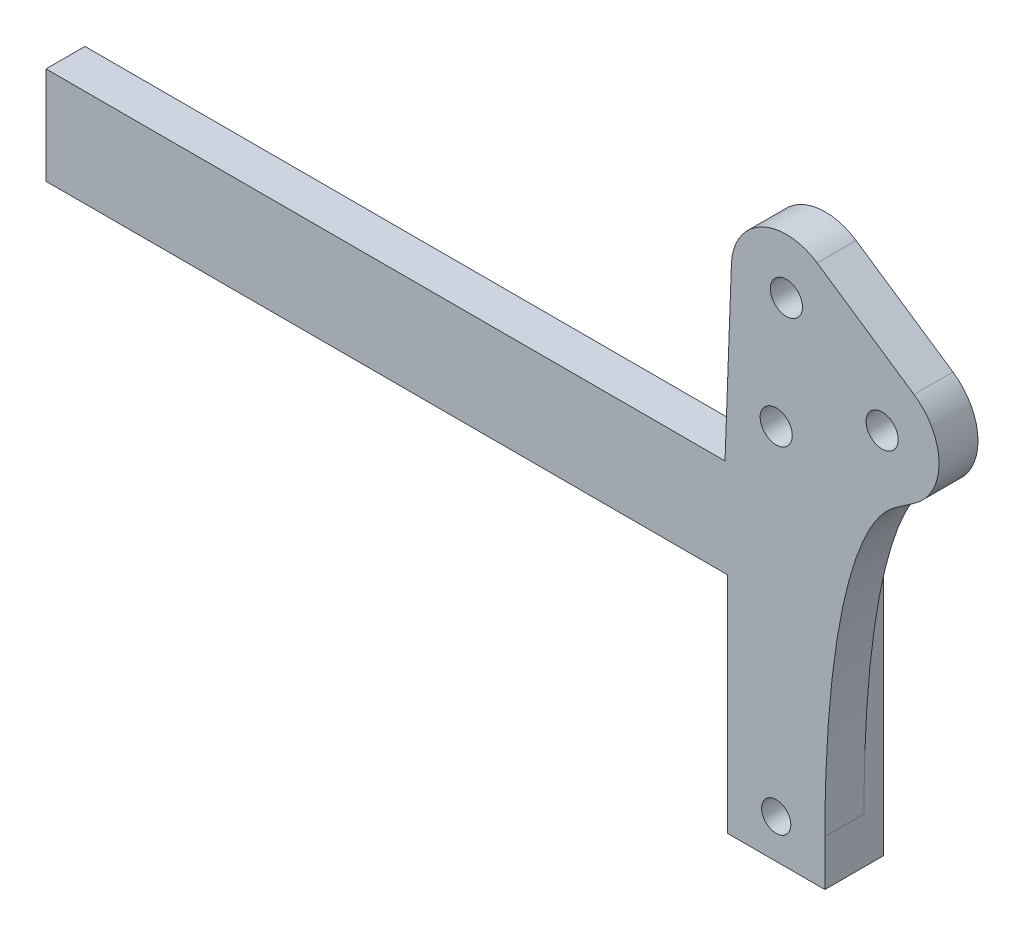
ISO-10303-21;
HEADER;
FILE_DESCRIPTION(('STEP AP214'),'2;1');
FILE_NAME('part.step','',(''),(''),'','','');
FILE_SCHEMA(('AUTOMOTIVE_DESIGN { 1 0 10303 214 1 1 1 1 }'));
ENDSEC;
DATA;
#1=APPLICATION_CONTEXT('core data for automotive mechanical design processes');
#2=APPLICATION_PROTOCOL_DEFINITION('international standard','automotive_design',2000,#1);
#3=PRODUCT_CONTEXT('',#1,'mechanical');
#4=PRODUCT('Part','Part','',(#3));
#5=PRODUCT_RELATED_PRODUCT_CATEGORY('part','',(#4));
#6=PRODUCT_DEFINITION_FORMATION('','',#4);
#7=PRODUCT_DEFINITION_CONTEXT('part definition',#1,'design');
#8=PRODUCT_DEFINITION('design','',#6,#7);
#9=PRODUCT_DEFINITION_SHAPE('','',#8);
#10=(LENGTH_UNIT() NAMED_UNIT(*) SI_UNIT(.MILLI.,.METRE.));
#11=(NAMED_UNIT(*) PLANE_ANGLE_UNIT() SI_UNIT($,.RADIAN.));
#12=(NAMED_UNIT(*) SI_UNIT($,.STERADIAN.) SOLID_ANGLE_UNIT());
#13=UNCERTAINTY_MEASURE_WITH_UNIT(LENGTH_MEASURE(1.E-05),#10,'distance_accuracy_value','');
#14=(GEOMETRIC_REPRESENTATION_CONTEXT(3) GLOBAL_UNCERTAINTY_ASSIGNED_CONTEXT((#13)) GLOBAL_UNIT_ASSIGNED_CONTEXT((#10,
#11,#12)) REPRESENTATION_CONTEXT('',''));
#15=CARTESIAN_POINT('',(0.,0.,0.));
#16=DIRECTION('',(0.,0.,1.));
#17=DIRECTION('',(1.,0.,0.));
#18=AXIS2_PLACEMENT_3D('',#15,#16,#17);
#19=CARTESIAN_POINT('',(40.,0.,6.));
#20=DIRECTION('',(1.,0.,0.));
#21=DIRECTION('',(0.,1.,0.));
#22=AXIS2_PLACEMENT_3D('',#19,#20,#21);
#23=PLANE('',#22);
#24=DIRECTION('',(0.,0.,1.));
#25=VECTOR('',#24,1.);
#26=CARTESIAN_POINT('',(40.,4.61249162773132,6.));
#27=LINE('',#26,#25);
#28=CARTESIAN_POINT('',(40.,4.61249162773132,0.));
#29=VERTEX_POINT('',#28);
#30=CARTESIAN_POINT('',(40.,4.61249162773133,2.));
#31=VERTEX_POINT('',#30);
#32=EDGE_CURVE('E178',#29,#31,#27,.T.);
#33=ORIENTED_EDGE('',*,*,#32,.T.);
#34=DIRECTION('',(0.,-1.,0.));
#35=VECTOR('',#34,1.);
#36=CARTESIAN_POINT('',(40.,0.,2.));
#37=LINE('',#36,#35);
#38=CARTESIAN_POINT('',(40.,-23.2876292932115,2.));
#39=VERTEX_POINT('',#38);
#40=EDGE_CURVE('E67',#31,#39,#37,.T.);
#41=ORIENTED_EDGE('',*,*,#40,.T.);
#42=CARTESIAN_POINT('',(40.,-23.2876292932115,6.20000000000002));
#43=CARTESIAN_POINT('',(40.,-23.2876292932115,4.73333333333335));
#44=CARTESIAN_POINT('',(40.,-23.2876292932115,3.26666666666667));
#45=CARTESIAN_POINT('',(40.,-23.2876292932115,1.8));
#46=(BOUNDED_CURVE() B_SPLINE_CURVE(3,(#42,#43,#44,#45),.UNSPECIFIED.,.F.,
.F.) B_SPLINE_CURVE_WITH_KNOTS((4,4),(-0.03783313004407,-0.03343313004407),
.UNSPECIFIED.) CURVE() GEOMETRIC_REPRESENTATION_ITEM() RATIONAL_B_SPLINE_CURVE((1.,1.,1.,1.)) REPRESENTATION_ITEM(''));
#47=CARTESIAN_POINT('',(40.,-23.2876292932115,6.));
#48=VERTEX_POINT('',#47);
#49=EDGE_CURVE('E268',#39,#48,#46,.F.);
#50=ORIENTED_EDGE('',*,*,#49,.T.);
#51=DIRECTION('',(0.,-1.,0.));
#52=VECTOR('',#51,1.);
#53=CARTESIAN_POINT('',(40.,0.,6.));
#54=LINE('',#53,#52);
#55=CARTESIAN_POINT('',(40.,-28.,6.));
#56=VERTEX_POINT('',#55);
#57=EDGE_CURVE('E259',#48,#56,#54,.T.);
#58=ORIENTED_EDGE('',*,*,#57,.T.);
#59=DIRECTION('',(0.,0.,-1.));
#60=VECTOR('',#59,1.);
#61=CARTESIAN_POINT('',(40.,-28.,6.));
#62=LINE('',#61,#60);
#63=CARTESIAN_POINT('',(40.,-28.,0.));
#64=VERTEX_POINT('',#63);
#65=EDGE_CURVE('E371',#56,#64,#62,.T.);
#66=ORIENTED_EDGE('',*,*,#65,.T.);
#67=DIRECTION('',(0.,-1.,0.));
#68=VECTOR('',#67,1.);
#69=CARTESIAN_POINT('',(40.,0.,0.));
#70=LINE('',#69,#68);
#71=EDGE_CURVE('E253',#29,#64,#70,.T.);
#72=ORIENTED_EDGE('',*,*,#71,.F.);
#73=EDGE_LOOP('',(#33,#41,#50,#58,#66,#72));
#74=FACE_BOUND('',#73,.T.);
#75=ADVANCED_FACE('F46',(#74),#23,.T.);
#76=CARTESIAN_POINT('',(30.,0.,6.));
#77=DIRECTION('',(1.,0.,0.));
#78=DIRECTION('',(0.,1.,0.));
#79=AXIS2_PLACEMENT_3D('',#76,#77,#78);
#80=PLANE('',#79);
#81=DIRECTION('',(0.,0.,1.));
#82=VECTOR('',#81,1.);
#83=CARTESIAN_POINT('',(30.,4.64834733316593,-4.));
#84=LINE('',#83,#82);
#85=CARTESIAN_POINT('',(30.,4.64834733316593,0.));
#86=VERTEX_POINT('',#85);
#87=CARTESIAN_POINT('',(30.,4.64834733316593,2.));
#88=VERTEX_POINT('',#87);
#89=EDGE_CURVE('E174',#86,#88,#84,.T.);
#90=ORIENTED_EDGE('',*,*,#89,.F.);
#91=DIRECTION('',(0.,-1.,0.));
#92=VECTOR('',#91,1.);
#93=CARTESIAN_POINT('',(30.,0.,0.));
#94=LINE('',#93,#92);
#95=CARTESIAN_POINT('',(30.,-28.,0.));
#96=VERTEX_POINT('',#95);
#97=EDGE_CURVE('E377',#86,#96,#94,.T.);
#98=ORIENTED_EDGE('',*,*,#97,.T.);
#99=DIRECTION('',(0.,0.,-1.));
#100=VECTOR('',#99,1.);
#101=CARTESIAN_POINT('',(30.,-28.,6.));
#102=LINE('',#101,#100);
#103=CARTESIAN_POINT('',(30.,-28.,6.));
#104=VERTEX_POINT('',#103);
#105=EDGE_CURVE('E368',#104,#96,#102,.T.);
#106=ORIENTED_EDGE('',*,*,#105,.F.);
#107=DIRECTION('',(0.,-1.,0.));
#108=VECTOR('',#107,1.);
#109=CARTESIAN_POINT('',(30.,0.,6.));
#110=LINE('',#109,#108);
#111=CARTESIAN_POINT('',(30.,-5.,6.));
#112=VERTEX_POINT('',#111);
#113=EDGE_CURVE('E382',#112,#104,#110,.T.);
#114=ORIENTED_EDGE('',*,*,#113,.F.);
#115=DIRECTION('',(0.,0.,-1.));
#116=VECTOR('',#115,1.);
#117=CARTESIAN_POINT('',(30.,-5.,6.));
#118=LINE('',#117,#116);
#119=CARTESIAN_POINT('',(30.,-5.,2.));
#120=VERTEX_POINT('',#119);
#121=EDGE_CURVE('E363',#112,#120,#118,.T.);
#122=ORIENTED_EDGE('',*,*,#121,.T.);
#123=DIRECTION('',(0.,-1.,0.));
#124=VECTOR('',#123,1.);
#125=CARTESIAN_POINT('',(30.,0.,2.));
#126=LINE('',#125,#124);
#127=EDGE_CURVE('E245',#88,#120,#126,.T.);
#128=ORIENTED_EDGE('',*,*,#127,.F.);
#129=EDGE_LOOP('',(#90,#98,#106,#114,#122,#128));
#130=FACE_BOUND('',#129,.T.);
#131=ADVANCED_FACE('F282',(#130),#80,.F.);
#132=CARTESIAN_POINT('',(0.,0.,0.));
#133=DIRECTION('',(0.,0.,1.));
#134=DIRECTION('',(1.,0.,0.));
#135=AXIS2_PLACEMENT_3D('',#132,#133,#134);
#136=PLANE('',#135);
#137=CARTESIAN_POINT('',(35.,-24.,0.));
#138=DIRECTION('',(0.,0.,1.));
#139=DIRECTION('',(1.,0.,0.));
#140=AXIS2_PLACEMENT_3D('',#137,#138,#139);
#141=CIRCLE('',#140,1.5);
#142=CARTESIAN_POINT('',(36.5,-24.,0.));
#143=VERTEX_POINT('',#142);
#144=EDGE_CURVE('E183',#143,#143,#141,.T.);
#145=ORIENTED_EDGE('',*,*,#144,.T.);
#146=EDGE_LOOP('',(#145));
#147=FACE_BOUND('',#146,.T.);
#148=CARTESIAN_POINT('',(35.,10.7,0.));
#149=DIRECTION('',(0.,0.,1.));
#150=DIRECTION('',(1.,0.,0.));
#151=AXIS2_PLACEMENT_3D('',#148,#149,#150);
#152=CIRCLE('',#151,7.85);
#153=CARTESIAN_POINT('',(39.4569044098538,4.23791805364355,0.));
#154=VERTEX_POINT('',#153);
#155=EDGE_CURVE('E180',#154,#86,#152,.F.);
#156=ORIENTED_EDGE('',*,*,#155,.F.);
#157=DIRECTION('',(-0.823195152402095,-0.567758523548252,0.));
#158=VECTOR('',#157,1.);
#159=CARTESIAN_POINT('',(10.7382214587901,-15.5693864269128,0.));
#160=LINE('',#159,#158);
#161=EDGE_CURVE('E161',#29,#154,#160,.T.);
#162=ORIENTED_EDGE('',*,*,#161,.F.);
#163=ORIENTED_EDGE('',*,*,#71,.T.);
#164=DIRECTION('',(-1.,0.,0.));
#165=VECTOR('',#164,1.);
#166=CARTESIAN_POINT('',(0.,-28.,0.));
#167=LINE('',#166,#165);
#168=EDGE_CURVE('E261',#64,#96,#167,.T.);
#169=ORIENTED_EDGE('',*,*,#168,.T.);
#170=ORIENTED_EDGE('',*,*,#97,.F.);
#171=EDGE_LOOP('',(#156,#162,#163,#169,#170));
#172=FACE_BOUND('',#171,.T.);
#173=ADVANCED_FACE('F299',(#147,#172),#136,.F.);
#174=CARTESIAN_POINT('',(35.,10.7,39.63313004407));
#175=DIRECTION('',(0.,0.,-1.));
#176=DIRECTION('',(-1.,0.,0.));
#177=AXIS2_PLACEMENT_3D('',#174,#175,#176);
#178=CYLINDRICAL_SURFACE('',#177,1.65);
#179=CARTESIAN_POINT('',(35.,10.7,6.));
#180=DIRECTION('',(0.,0.,1.));
#181=DIRECTION('',(1.,0.,0.));
#182=AXIS2_PLACEMENT_3D('',#179,#180,#181);
#183=CIRCLE('',#182,1.65);
#184=CARTESIAN_POINT('',(36.65,10.7,6.));
#185=VERTEX_POINT('',#184);
#186=EDGE_CURVE('E246',#185,#185,#183,.F.);
#187=ORIENTED_EDGE('',*,*,#186,.F.);
#188=EDGE_LOOP('',(#187));
#189=FACE_BOUND('',#188,.T.);
#190=CARTESIAN_POINT('',(35.,10.7,2.));
#191=DIRECTION('',(0.,0.,-1.));
#192=DIRECTION('',(-1.,0.,0.));
#193=AXIS2_PLACEMENT_3D('',#190,#191,#192);
#194=CIRCLE('',#193,1.65);
#195=CARTESIAN_POINT('',(33.35,10.7,2.));
#196=VERTEX_POINT('',#195);
#197=EDGE_CURVE('E213',#196,#196,#194,.T.);
#198=ORIENTED_EDGE('',*,*,#197,.T.);
#199=EDGE_LOOP('',(#198));
#200=FACE_BOUND('',#199,.T.);
#201=ADVANCED_FACE('F287',(#189,#200),#178,.F.);
#202=CARTESIAN_POINT('',(0.,5.,6.));
#203=DIRECTION('',(0.,1.,0.));
#204=DIRECTION('',(0.,0.,1.));
#205=AXIS2_PLACEMENT_3D('',#202,#203,#204);
#206=PLANE('',#205);
#207=DIRECTION('',(0.,0.,-1.));
#208=VECTOR('',#207,1.);
#209=CARTESIAN_POINT('',(29.7424226194983,5.,39.63313004407));
#210=LINE('',#209,#208);
#211=CARTESIAN_POINT('',(29.7424226194983,5.,6.));
#212=VERTEX_POINT('',#211);
#213=CARTESIAN_POINT('',(29.7424226194983,5.,2.));
#214=VERTEX_POINT('',#213);
#215=EDGE_CURVE('E230',#212,#214,#210,.T.);
#216=ORIENTED_EDGE('',*,*,#215,.T.);
#217=DIRECTION('',(1.,0.,0.));
#218=VECTOR('',#217,1.);
#219=CARTESIAN_POINT('',(0.,5.,2.));
#220=LINE('',#219,#218);
#221=CARTESIAN_POINT('',(-40.,5.,2.));
#222=VERTEX_POINT('',#221);
#223=EDGE_CURVE('E248',#222,#214,#220,.T.);
#224=ORIENTED_EDGE('',*,*,#223,.F.);
#225=DIRECTION('',(0.,0.,-1.));
#226=VECTOR('',#225,1.);
#227=CARTESIAN_POINT('',(-40.,5.,6.));
#228=LINE('',#227,#226);
#229=CARTESIAN_POINT('',(-40.,5.,6.));
#230=VERTEX_POINT('',#229);
#231=EDGE_CURVE('E355',#230,#222,#228,.T.);
#232=ORIENTED_EDGE('',*,*,#231,.F.);
#233=DIRECTION('',(1.,0.,0.));
#234=VECTOR('',#233,1.);
#235=CARTESIAN_POINT('',(0.,5.,6.));
#236=LINE('',#235,#234);
#237=EDGE_CURVE('E256',#230,#212,#236,.T.);
#238=ORIENTED_EDGE('',*,*,#237,.T.);
#239=EDGE_LOOP('',(#216,#224,#232,#238));
#240=FACE_BOUND('',#239,.T.);
#241=ADVANCED_FACE('F283',(#240),#206,.T.);
#242=CARTESIAN_POINT('',(-40.,0.,6.));
#243=DIRECTION('',(-1.,0.,0.));
#244=DIRECTION('',(0.,0.,1.));
#245=AXIS2_PLACEMENT_3D('',#242,#243,#244);
#246=PLANE('',#245);
#247=DIRECTION('',(0.,1.,0.));
#248=VECTOR('',#247,1.);
#249=CARTESIAN_POINT('',(-40.,0.,2.));
#250=LINE('',#249,#248);
#251=CARTESIAN_POINT('',(-40.,-5.,2.));
#252=VERTEX_POINT('',#251);
#253=EDGE_CURVE('E251',#252,#222,#250,.T.);
#254=ORIENTED_EDGE('',*,*,#253,.F.);
#255=DIRECTION('',(0.,0.,-1.));
#256=VECTOR('',#255,1.);
#257=CARTESIAN_POINT('',(-40.,-5.,6.));
#258=LINE('',#257,#256);
#259=CARTESIAN_POINT('',(-40.,-5.,6.));
#260=VERTEX_POINT('',#259);
#261=EDGE_CURVE('E359',#260,#252,#258,.T.);
#262=ORIENTED_EDGE('',*,*,#261,.F.);
#263=DIRECTION('',(0.,1.,0.));
#264=VECTOR('',#263,1.);
#265=CARTESIAN_POINT('',(-40.,0.,6.));
#266=LINE('',#265,#264);
#267=EDGE_CURVE('E385',#260,#230,#266,.T.);
#268=ORIENTED_EDGE('',*,*,#267,.T.);
#269=ORIENTED_EDGE('',*,*,#231,.T.);
#270=EDGE_LOOP('',(#254,#262,#268,#269));
#271=FACE_BOUND('',#270,.T.);
#272=ADVANCED_FACE('F286',(#271),#246,.T.);
#273=CARTESIAN_POINT('',(0.,-5.,6.));
#274=DIRECTION('',(0.,1.,0.));
#275=DIRECTION('',(0.,0.,1.));
#276=AXIS2_PLACEMENT_3D('',#273,#274,#275);
#277=PLANE('',#276);
#278=ORIENTED_EDGE('',*,*,#261,.T.);
#279=DIRECTION('',(1.,0.,0.));
#280=VECTOR('',#279,1.);
#281=CARTESIAN_POINT('',(0.,-5.,2.));
#282=LINE('',#281,#280);
#283=EDGE_CURVE('E242',#252,#120,#282,.T.);
#284=ORIENTED_EDGE('',*,*,#283,.T.);
#285=ORIENTED_EDGE('',*,*,#121,.F.);
#286=DIRECTION('',(1.,0.,0.));
#287=VECTOR('',#286,1.);
#288=CARTESIAN_POINT('',(0.,-5.,6.));
#289=LINE('',#288,#287);
#290=EDGE_CURVE('E384',#260,#112,#289,.T.);
#291=ORIENTED_EDGE('',*,*,#290,.F.);
#292=EDGE_LOOP('',(#278,#284,#285,#291));
#293=FACE_BOUND('',#292,.T.);
#294=ADVANCED_FACE('F291',(#293),#277,.F.);
#295=CARTESIAN_POINT('',(0.,-28.,6.));
#296=DIRECTION('',(0.,-1.,0.));
#297=DIRECTION('',(0.,0.,-1.));
#298=AXIS2_PLACEMENT_3D('',#295,#296,#297);
#299=PLANE('',#298);
#300=ORIENTED_EDGE('',*,*,#168,.F.);
#301=ORIENTED_EDGE('',*,*,#65,.F.);
#302=DIRECTION('',(-1.,0.,0.));
#303=VECTOR('',#302,1.);
#304=CARTESIAN_POINT('',(0.,-28.,6.));
#305=LINE('',#304,#303);
#306=EDGE_CURVE('E374',#56,#104,#305,.T.);
#307=ORIENTED_EDGE('',*,*,#306,.T.);
#308=ORIENTED_EDGE('',*,*,#105,.T.);
#309=EDGE_LOOP('',(#300,#301,#307,#308));
#310=FACE_BOUND('',#309,.T.);
#311=ADVANCED_FACE('F295',(#310),#299,.T.);
#312=CARTESIAN_POINT('',(0.,0.,6.));
#313=DIRECTION('',(0.,0.,1.));
#314=DIRECTION('',(1.,0.,0.));
#315=AXIS2_PLACEMENT_3D('',#312,#313,#314);
#316=PLANE('',#315);
#317=CARTESIAN_POINT('',(35.,-24.,6.));
#318=DIRECTION('',(0.,0.,1.));
#319=DIRECTION('',(1.,0.,0.));
#320=AXIS2_PLACEMENT_3D('',#317,#318,#319);
#321=CIRCLE('',#320,1.5);
#322=CARTESIAN_POINT('',(36.5,-24.,6.));
#323=VERTEX_POINT('',#322);
#324=EDGE_CURVE('E184',#323,#323,#321,.T.);
#325=ORIENTED_EDGE('',*,*,#324,.F.);
#326=EDGE_LOOP('',(#325));
#327=FACE_BOUND('',#326,.T.);
#328=ORIENTED_EDGE('',*,*,#186,.T.);
#329=EDGE_LOOP('',(#328));
#330=FACE_BOUND('',#329,.T.);
#331=ORIENTED_EDGE('',*,*,#57,.F.);
#332=CARTESIAN_POINT('',(47.2896590580699,9.64017680287228,6.));
#333=CARTESIAN_POINT('',(40.,4.61249162773133,6.));
#334=CARTESIAN_POINT('',(40.,-23.2876292932115,6.));
#335=(BOUNDED_CURVE() B_SPLINE_CURVE(2,(#332,#333,#334),.UNSPECIFIED.,.F.,
.F.) B_SPLINE_CURVE_WITH_KNOTS((3,3),(0.,1.),
.UNSPECIFIED.) CURVE() GEOMETRIC_REPRESENTATION_ITEM() RATIONAL_B_SPLINE_CURVE((1.,
0.88536956225868,1.)) REPRESENTATION_ITEM(''));
#336=CARTESIAN_POINT('',(47.2896590580699,9.64017680287228,6.));
#337=VERTEX_POINT('',#336);
#338=EDGE_CURVE('E12',#48,#337,#335,.F.);
#339=ORIENTED_EDGE('',*,*,#338,.T.);
#340=DIRECTION('',(-0.823195152402095,-0.567758523548252,0.));
#341=VECTOR('',#340,1.);
#342=CARTESIAN_POINT('',(10.7382214587901,-15.5693864269128,6.));
#343=LINE('',#342,#341);
#344=CARTESIAN_POINT('',(49.1970808071971,10.9557274993362,6.));
#345=VERTEX_POINT('',#344);
#346=EDGE_CURVE('E198',#345,#337,#343,.T.);
#347=ORIENTED_EDGE('',*,*,#346,.F.);
#348=CARTESIAN_POINT('',(45.8756934444398,15.7714191408884,6.));
#349=DIRECTION('',(0.,0.,1.));
#350=DIRECTION('',(1.,0.,0.));
#351=AXIS2_PLACEMENT_3D('',#348,#349,#350);
#352=CIRCLE('',#351,5.85);
#353=CARTESIAN_POINT('',(49.1507822095529,20.6187166952613,6.));
#354=VERTEX_POINT('',#353);
#355=EDGE_CURVE('E195',#354,#345,#352,.F.);
#356=ORIENTED_EDGE('',*,*,#355,.F.);
#357=DIRECTION('',(0.828597872542378,-0.559844233352675,0.));
#358=VECTOR('',#357,1.);
#359=CARTESIAN_POINT('',(24.9698403813028,36.9566307645373,6.));
#360=LINE('',#359,#358);
#361=CARTESIAN_POINT('',(39.2089888314145,27.3359143569654,6.));
#362=VERTEX_POINT('',#361);
#363=EDGE_CURVE('E192',#362,#354,#360,.T.);
#364=ORIENTED_EDGE('',*,*,#363,.F.);
#365=CARTESIAN_POINT('',(36.0458689129719,22.6543363771009,6.));
#366=DIRECTION('',(0.,0.,1.));
#367=DIRECTION('',(1.,0.,0.));
#368=AXIS2_PLACEMENT_3D('',#365,#366,#367);
#369=CIRCLE('',#368,5.65);
#370=CARTESIAN_POINT('',(30.3996900891645,22.8620975129981,6.));
#371=VERTEX_POINT('',#370);
#372=EDGE_CURVE('E189',#371,#362,#369,.F.);
#373=ORIENTED_EDGE('',*,*,#372,.F.);
#374=DIRECTION('',(0.0367718824596779,0.999323685629622,0.));
#375=VECTOR('',#374,1.);
#376=CARTESIAN_POINT('',(29.5184707025254,-1.0861843371388,6.));
#377=LINE('',#376,#375);
#378=EDGE_CURVE('E187',#212,#371,#377,.T.);
#379=ORIENTED_EDGE('',*,*,#378,.F.);
#380=ORIENTED_EDGE('',*,*,#237,.F.);
#381=ORIENTED_EDGE('',*,*,#267,.F.);
#382=ORIENTED_EDGE('',*,*,#290,.T.);
#383=ORIENTED_EDGE('',*,*,#113,.T.);
#384=ORIENTED_EDGE('',*,*,#306,.F.);
#385=EDGE_LOOP('',(#331,#339,#347,#356,#364,#373,#379,#380,#381,#382,#383,#384));
#386=FACE_BOUND('',#385,.T.);
#387=CARTESIAN_POINT('',(45.8756934444398,15.7714191408884,6.));
#388=DIRECTION('',(0.,0.,1.));
#389=DIRECTION('',(1.,0.,0.));
#390=AXIS2_PLACEMENT_3D('',#387,#388,#389);
#391=CIRCLE('',#390,1.65);
#392=CARTESIAN_POINT('',(47.5256934444398,15.7714191408884,6.));
#393=VERTEX_POINT('',#392);
#394=EDGE_CURVE('E449',#393,#393,#391,.F.);
#395=ORIENTED_EDGE('',*,*,#394,.T.);
#396=EDGE_LOOP('',(#395));
#397=FACE_BOUND('',#396,.T.);
#398=CARTESIAN_POINT('',(36.0458689129719,22.6543363771009,6.));
#399=DIRECTION('',(0.,0.,1.));
#400=DIRECTION('',(1.,0.,0.));
#401=AXIS2_PLACEMENT_3D('',#398,#399,#400);
#402=CIRCLE('',#401,1.65);
#403=CARTESIAN_POINT('',(37.6958689129719,22.6543363771009,6.));
#404=VERTEX_POINT('',#403);
#405=EDGE_CURVE('E201',#404,#404,#402,.F.);
#406=ORIENTED_EDGE('',*,*,#405,.T.);
#407=EDGE_LOOP('',(#406));
#408=FACE_BOUND('',#407,.T.);
#409=ADVANCED_FACE('F303',(#327,#330,#386,#397,#408),#316,.T.);
#410=CARTESIAN_POINT('',(0.,0.,2.));
#411=DIRECTION('',(0.,0.,1.));
#412=DIRECTION('',(1.,0.,0.));
#413=AXIS2_PLACEMENT_3D('',#410,#411,#412);
#414=PLANE('',#413);
#415=ORIENTED_EDGE('',*,*,#197,.F.);
#416=EDGE_LOOP('',(#415));
#417=FACE_BOUND('',#416,.T.);
#418=DIRECTION('',(0.0367718824596779,0.999323685629622,0.));
#419=VECTOR('',#418,1.);
#420=CARTESIAN_POINT('',(29.5184707025254,-1.0861843371388,2.));
#421=LINE('',#420,#419);
#422=CARTESIAN_POINT('',(30.3996900891645,22.8620975129981,2.));
#423=VERTEX_POINT('',#422);
#424=EDGE_CURVE('E212',#214,#423,#421,.T.);
#425=ORIENTED_EDGE('',*,*,#424,.T.);
#426=CARTESIAN_POINT('',(36.0458689129719,22.6543363771009,2.));
#427=DIRECTION('',(0.,0.,-1.));
#428=DIRECTION('',(-1.,0.,0.));
#429=AXIS2_PLACEMENT_3D('',#426,#427,#428);
#430=CIRCLE('',#429,5.65);
#431=CARTESIAN_POINT('',(39.2089888314145,27.3359143569654,2.));
#432=VERTEX_POINT('',#431);
#433=EDGE_CURVE('E221',#423,#432,#430,.T.);
#434=ORIENTED_EDGE('',*,*,#433,.T.);
#435=DIRECTION('',(0.828597872542378,-0.559844233352675,0.));
#436=VECTOR('',#435,1.);
#437=CARTESIAN_POINT('',(24.9698403813028,36.9566307645373,2.));
#438=LINE('',#437,#436);
#439=CARTESIAN_POINT('',(49.1507822095529,20.6187166952613,2.));
#440=VERTEX_POINT('',#439);
#441=EDGE_CURVE('E224',#432,#440,#438,.T.);
#442=ORIENTED_EDGE('',*,*,#441,.T.);
#443=CARTESIAN_POINT('',(45.8756934444398,15.7714191408884,2.));
#444=DIRECTION('',(0.,0.,-1.));
#445=DIRECTION('',(-1.,0.,0.));
#446=AXIS2_PLACEMENT_3D('',#443,#444,#445);
#447=CIRCLE('',#446,5.85);
#448=CARTESIAN_POINT('',(49.1970808071971,10.9557274993361,2.));
#449=VERTEX_POINT('',#448);
#450=EDGE_CURVE('E227',#440,#449,#447,.T.);
#451=ORIENTED_EDGE('',*,*,#450,.T.);
#452=DIRECTION('',(-0.823195152402095,-0.567758523548252,0.));
#453=VECTOR('',#452,1.);
#454=CARTESIAN_POINT('',(10.7382214587901,-15.5693864269128,2.));
#455=LINE('',#454,#453);
#456=CARTESIAN_POINT('',(47.28965905807,9.64017680287231,2.));
#457=VERTEX_POINT('',#456);
#458=EDGE_CURVE('E209',#449,#457,#455,.T.);
#459=ORIENTED_EDGE('',*,*,#458,.T.);
#460=CARTESIAN_POINT('',(40.,-23.2876292932115,2.));
#461=CARTESIAN_POINT('',(40.,4.61249162773133,2.));
#462=CARTESIAN_POINT('',(47.2896590580699,9.64017680287228,2.));
#463=(BOUNDED_CURVE() B_SPLINE_CURVE(2,(#460,#461,#462),.UNSPECIFIED.,.F.,
.F.) B_SPLINE_CURVE_WITH_KNOTS((3,3),(0.,1.),
.UNSPECIFIED.) CURVE() GEOMETRIC_REPRESENTATION_ITEM() RATIONAL_B_SPLINE_CURVE((1.,
0.88536956225868,1.)) REPRESENTATION_ITEM(''));
#464=EDGE_CURVE('E60',#457,#39,#463,.F.);
#465=ORIENTED_EDGE('',*,*,#464,.T.);
#466=ORIENTED_EDGE('',*,*,#40,.F.);
#467=DIRECTION('',(-0.823195152402095,-0.567758523548252,0.));
#468=VECTOR('',#467,1.);
#469=CARTESIAN_POINT('',(10.7382214587901,-15.5693864269128,2.));
#470=LINE('',#469,#468);
#471=CARTESIAN_POINT('',(39.4569044098538,4.23791805364355,2.));
#472=VERTEX_POINT('',#471);
#473=EDGE_CURVE('E159',#31,#472,#470,.T.);
#474=ORIENTED_EDGE('',*,*,#473,.T.);
#475=CARTESIAN_POINT('',(35.,10.7,2.));
#476=DIRECTION('',(0.,0.,-1.));
#477=DIRECTION('',(-1.,0.,0.));
#478=AXIS2_PLACEMENT_3D('',#475,#476,#477);
#479=CIRCLE('',#478,7.85);
#480=EDGE_CURVE('E169',#472,#88,#479,.T.);
#481=ORIENTED_EDGE('',*,*,#480,.T.);
#482=ORIENTED_EDGE('',*,*,#127,.T.);
#483=ORIENTED_EDGE('',*,*,#283,.F.);
#484=ORIENTED_EDGE('',*,*,#253,.T.);
#485=ORIENTED_EDGE('',*,*,#223,.T.);
#486=EDGE_LOOP('',(#425,#434,#442,#451,#459,#465,#466,#474,#481,#482,#483,#484,#485));
#487=FACE_BOUND('',#486,.T.);
#488=CARTESIAN_POINT('',(36.0458689129719,22.6543363771009,2.));
#489=DIRECTION('',(0.,0.,-1.));
#490=DIRECTION('',(-1.,0.,0.));
#491=AXIS2_PLACEMENT_3D('',#488,#489,#490);
#492=CIRCLE('',#491,1.65);
#493=CARTESIAN_POINT('',(34.3958689129719,22.6543363771009,2.));
#494=VERTEX_POINT('',#493);
#495=EDGE_CURVE('E207',#494,#494,#492,.T.);
#496=ORIENTED_EDGE('',*,*,#495,.F.);
#497=EDGE_LOOP('',(#496));
#498=FACE_BOUND('',#497,.T.);
#499=CARTESIAN_POINT('',(45.8756934444398,15.7714191408884,2.));
#500=DIRECTION('',(0.,0.,-1.));
#501=DIRECTION('',(-1.,0.,0.));
#502=AXIS2_PLACEMENT_3D('',#499,#500,#501);
#503=CIRCLE('',#502,1.65);
#504=CARTESIAN_POINT('',(44.2256934444398,15.7714191408884,2.));
#505=VERTEX_POINT('',#504);
#506=EDGE_CURVE('E446',#505,#505,#503,.T.);
#507=ORIENTED_EDGE('',*,*,#506,.F.);
#508=EDGE_LOOP('',(#507));
#509=FACE_BOUND('',#508,.T.);
#510=ADVANCED_FACE('F167',(#417,#487,#498,#509),#414,.F.);
#511=CARTESIAN_POINT('',(29.5184707025254,-1.0861843371388,39.63313004407));
#512=DIRECTION('',(-0.999323685629622,0.0367718824596779,0.));
#513=DIRECTION('',(-0.0367718824596779,-0.999323685629622,0.));
#514=AXIS2_PLACEMENT_3D('',#511,#512,#513);
#515=PLANE('',#514);
#516=ORIENTED_EDGE('',*,*,#378,.T.);
#517=DIRECTION('',(0.,0.,-1.));
#518=VECTOR('',#517,1.);
#519=CARTESIAN_POINT('',(30.3996900891645,22.8620975129981,39.63313004407));
#520=LINE('',#519,#518);
#521=EDGE_CURVE('E237',#371,#423,#520,.T.);
#522=ORIENTED_EDGE('',*,*,#521,.T.);
#523=ORIENTED_EDGE('',*,*,#424,.F.);
#524=ORIENTED_EDGE('',*,*,#215,.F.);
#525=EDGE_LOOP('',(#516,#522,#523,#524));
#526=FACE_BOUND('',#525,.T.);
#527=ADVANCED_FACE('F396',(#526),#515,.T.);
#528=CARTESIAN_POINT('',(45.8756934444398,15.7714191408884,39.63313004407));
#529=DIRECTION('',(0.,0.,-1.));
#530=DIRECTION('',(-1.,0.,0.));
#531=AXIS2_PLACEMENT_3D('',#528,#529,#530);
#532=CYLINDRICAL_SURFACE('',#531,1.65);
#533=ORIENTED_EDGE('',*,*,#506,.T.);
#534=EDGE_LOOP('',(#533));
#535=FACE_BOUND('',#534,.T.);
#536=ORIENTED_EDGE('',*,*,#394,.F.);
#537=EDGE_LOOP('',(#536));
#538=FACE_BOUND('',#537,.T.);
#539=ADVANCED_FACE('F427',(#535,#538),#532,.F.);
#540=CARTESIAN_POINT('',(36.0458689129719,22.6543363771009,39.63313004407));
#541=DIRECTION('',(0.,0.,-1.));
#542=DIRECTION('',(-1.,0.,0.));
#543=AXIS2_PLACEMENT_3D('',#540,#541,#542);
#544=CYLINDRICAL_SURFACE('',#543,1.65);
#545=ORIENTED_EDGE('',*,*,#495,.T.);
#546=EDGE_LOOP('',(#545));
#547=FACE_BOUND('',#546,.T.);
#548=ORIENTED_EDGE('',*,*,#405,.F.);
#549=EDGE_LOOP('',(#548));
#550=FACE_BOUND('',#549,.T.);
#551=ADVANCED_FACE('F420',(#547,#550),#544,.F.);
#552=CARTESIAN_POINT('',(36.0458689129719,22.6543363771009,39.63313004407));
#553=DIRECTION('',(0.,0.,-1.));
#554=DIRECTION('',(-1.,0.,0.));
#555=AXIS2_PLACEMENT_3D('',#552,#553,#554);
#556=CYLINDRICAL_SURFACE('',#555,5.65);
#557=ORIENTED_EDGE('',*,*,#521,.F.);
#558=ORIENTED_EDGE('',*,*,#372,.T.);
#559=DIRECTION('',(0.,0.,-1.));
#560=VECTOR('',#559,1.);
#561=CARTESIAN_POINT('',(39.2089888314145,27.3359143569654,39.63313004407));
#562=LINE('',#561,#560);
#563=EDGE_CURVE('E235',#362,#432,#562,.T.);
#564=ORIENTED_EDGE('',*,*,#563,.T.);
#565=ORIENTED_EDGE('',*,*,#433,.F.);
#566=EDGE_LOOP('',(#557,#558,#564,#565));
#567=FACE_BOUND('',#566,.T.);
#568=ADVANCED_FACE('F418',(#567),#556,.T.);
#569=CARTESIAN_POINT('',(24.9698403813028,36.9566307645373,39.63313004407));
#570=DIRECTION('',(0.559844233352675,0.828597872542378,0.));
#571=DIRECTION('',(-0.828597872542378,0.559844233352675,0.));
#572=AXIS2_PLACEMENT_3D('',#569,#570,#571);
#573=PLANE('',#572);
#574=ORIENTED_EDGE('',*,*,#563,.F.);
#575=ORIENTED_EDGE('',*,*,#363,.T.);
#576=DIRECTION('',(0.,0.,-1.));
#577=VECTOR('',#576,1.);
#578=CARTESIAN_POINT('',(49.1507822095529,20.6187166952613,39.63313004407));
#579=LINE('',#578,#577);
#580=EDGE_CURVE('E233',#354,#440,#579,.T.);
#581=ORIENTED_EDGE('',*,*,#580,.T.);
#582=ORIENTED_EDGE('',*,*,#441,.F.);
#583=EDGE_LOOP('',(#574,#575,#581,#582));
#584=FACE_BOUND('',#583,.T.);
#585=ADVANCED_FACE('F416',(#584),#573,.T.);
#586=CARTESIAN_POINT('',(45.8756934444398,15.7714191408884,39.63313004407));
#587=DIRECTION('',(0.,0.,-1.));
#588=DIRECTION('',(-1.,0.,0.));
#589=AXIS2_PLACEMENT_3D('',#586,#587,#588);
#590=CYLINDRICAL_SURFACE('',#589,5.85);
#591=ORIENTED_EDGE('',*,*,#580,.F.);
#592=ORIENTED_EDGE('',*,*,#355,.T.);
#593=DIRECTION('',(0.,0.,-1.));
#594=VECTOR('',#593,1.);
#595=CARTESIAN_POINT('',(49.1970808071971,10.9557274993361,39.63313004407));
#596=LINE('',#595,#594);
#597=EDGE_CURVE('E231',#345,#449,#596,.T.);
#598=ORIENTED_EDGE('',*,*,#597,.T.);
#599=ORIENTED_EDGE('',*,*,#450,.F.);
#600=EDGE_LOOP('',(#591,#592,#598,#599));
#601=FACE_BOUND('',#600,.T.);
#602=ADVANCED_FACE('F412',(#601),#590,.T.);
#603=CARTESIAN_POINT('',(10.7382214587901,-15.5693864269128,39.63313004407));
#604=DIRECTION('',(0.567758523548252,-0.823195152402095,0.));
#605=DIRECTION('',(0.823195152402095,0.567758523548252,0.));
#606=AXIS2_PLACEMENT_3D('',#603,#604,#605);
#607=PLANE('',#606);
#608=ORIENTED_EDGE('',*,*,#346,.T.);
#609=CARTESIAN_POINT('',(47.2896590580699,9.64017680287228,1.8));
#610=CARTESIAN_POINT('',(47.2896590580699,9.64017680287228,3.26666666666667));
#611=CARTESIAN_POINT('',(47.2896590580699,9.64017680287228,4.73333333333335));
#612=CARTESIAN_POINT('',(47.2896590580699,9.64017680287228,6.20000000000002));
#613=(BOUNDED_CURVE() B_SPLINE_CURVE(3,(#609,#610,#611,#612),.UNSPECIFIED.,.F.,
.F.) B_SPLINE_CURVE_WITH_KNOTS((4,4),(-0.03783313004407,-0.03343313004407),
.UNSPECIFIED.) CURVE() GEOMETRIC_REPRESENTATION_ITEM() RATIONAL_B_SPLINE_CURVE((1.,1.,1.,1.)) REPRESENTATION_ITEM(''));
#614=EDGE_CURVE('E338',#337,#457,#613,.F.);
#615=ORIENTED_EDGE('',*,*,#614,.T.);
#616=ORIENTED_EDGE('',*,*,#458,.F.);
#617=ORIENTED_EDGE('',*,*,#597,.F.);
#618=EDGE_LOOP('',(#608,#615,#616,#617));
#619=FACE_BOUND('',#618,.T.);
#620=ADVANCED_FACE('F408',(#619),#607,.T.);
#621=CARTESIAN_POINT('',(35.,-24.,7.));
#622=DIRECTION('',(0.,0.,-1.));
#623=DIRECTION('',(-1.,0.,0.));
#624=AXIS2_PLACEMENT_3D('',#621,#622,#623);
#625=CYLINDRICAL_SURFACE('',#624,1.5);
#626=ORIENTED_EDGE('',*,*,#324,.T.);
#627=EDGE_LOOP('',(#626));
#628=FACE_BOUND('',#627,.T.);
#629=ORIENTED_EDGE('',*,*,#144,.F.);
#630=EDGE_LOOP('',(#629));
#631=FACE_BOUND('',#630,.T.);
#632=ADVANCED_FACE('F435',(#628,#631),#625,.F.);
#633=CARTESIAN_POINT('',(35.,10.7,-4.));
#634=DIRECTION('',(0.,0.,1.));
#635=DIRECTION('',(1.,0.,0.));
#636=AXIS2_PLACEMENT_3D('',#633,#634,#635);
#637=CYLINDRICAL_SURFACE('',#636,7.85);
#638=ORIENTED_EDGE('',*,*,#89,.T.);
#639=ORIENTED_EDGE('',*,*,#480,.F.);
#640=DIRECTION('',(0.,0.,1.));
#641=VECTOR('',#640,1.);
#642=CARTESIAN_POINT('',(39.4569044098538,4.23791805364355,-4.));
#643=LINE('',#642,#641);
#644=EDGE_CURVE('E157',#154,#472,#643,.T.);
#645=ORIENTED_EDGE('',*,*,#644,.F.);
#646=ORIENTED_EDGE('',*,*,#155,.T.);
#647=EDGE_LOOP('',(#638,#639,#645,#646));
#648=FACE_BOUND('',#647,.T.);
#649=ADVANCED_FACE('F172',(#648),#637,.F.);
#650=CARTESIAN_POINT('',(10.7382214587901,-15.5693864269128,-4.));
#651=DIRECTION('',(-0.567758523548252,0.823195152402095,0.));
#652=DIRECTION('',(-0.823195152402095,-0.567758523548252,0.));
#653=AXIS2_PLACEMENT_3D('',#650,#651,#652);
#654=PLANE('',#653);
#655=ORIENTED_EDGE('',*,*,#161,.T.);
#656=ORIENTED_EDGE('',*,*,#644,.T.);
#657=ORIENTED_EDGE('',*,*,#473,.F.);
#658=ORIENTED_EDGE('',*,*,#32,.F.);
#659=EDGE_LOOP('',(#655,#656,#657,#658));
#660=FACE_BOUND('',#659,.T.);
#661=ADVANCED_FACE('F158',(#660),#654,.T.);
#662=CARTESIAN_POINT('',(40.,-23.2876292932115,1.8));
#663=CARTESIAN_POINT('',(40.,-23.2876292932115,3.26666666666667));
#664=CARTESIAN_POINT('',(40.,-23.2876292932115,4.73333333333335));
#665=CARTESIAN_POINT('',(40.,-23.2876292932115,6.20000000000002));
#666=CARTESIAN_POINT('',(40.,4.61249162773133,1.8));
#667=CARTESIAN_POINT('',(40.,4.61249162773133,3.26666666666667));
#668=CARTESIAN_POINT('',(40.,4.61249162773133,4.73333333333335));
#669=CARTESIAN_POINT('',(40.,4.61249162773133,6.20000000000002));
#670=CARTESIAN_POINT('',(47.2896590580699,9.64017680287228,1.8));
#671=CARTESIAN_POINT('',(47.2896590580699,9.64017680287228,3.26666666666667));
#672=CARTESIAN_POINT('',(47.2896590580699,9.64017680287228,4.73333333333335));
#673=CARTESIAN_POINT('',(47.2896590580699,9.64017680287228,6.20000000000002));
#674=(BOUNDED_SURFACE() B_SPLINE_SURFACE(2,3,((#662,#663,#664,#665),(#666,#667,#668,#669),(#670,
#671,#672,#673)),.UNSPECIFIED.,.F.,.F.,.F.) B_SPLINE_SURFACE_WITH_KNOTS((3,3),(4,4),(0.,1.),
(-0.03783313004407,-0.03343313004407),
.UNSPECIFIED.) GEOMETRIC_REPRESENTATION_ITEM() RATIONAL_B_SPLINE_SURFACE(((1.,1.,1.,1.),
(0.88536956225868,0.88536956225868,0.88536956225868,0.88536956225868),(1.,1.,1.,1.))) REPRESENTATION_ITEM('') SURFACE());
#675=ORIENTED_EDGE('',*,*,#338,.F.);
#676=ORIENTED_EDGE('',*,*,#49,.F.);
#677=ORIENTED_EDGE('',*,*,#464,.F.);
#678=ORIENTED_EDGE('',*,*,#614,.F.);
#679=EDGE_LOOP('',(#675,#676,#677,#678));
#680=FACE_BOUND('',#679,.T.);
#681=ADVANCED_FACE('F49',(#680),#674,.T.);
#682=CLOSED_SHELL('',(#75,#131,#173,#201,#241,#272,#294,#311,#409,#510,#527,#539,#551,#568,#585,
#602,#620,#632,#649,#661,#681));
#683=MANIFOLD_SOLID_BREP('B2',#682);
#684=ADVANCED_BREP_SHAPE_REPRESENTATION('',(#18,#683),#14);
#685=SHAPE_DEFINITION_REPRESENTATION(#9,#684);
ENDSEC;
END-ISO-10303-21;
